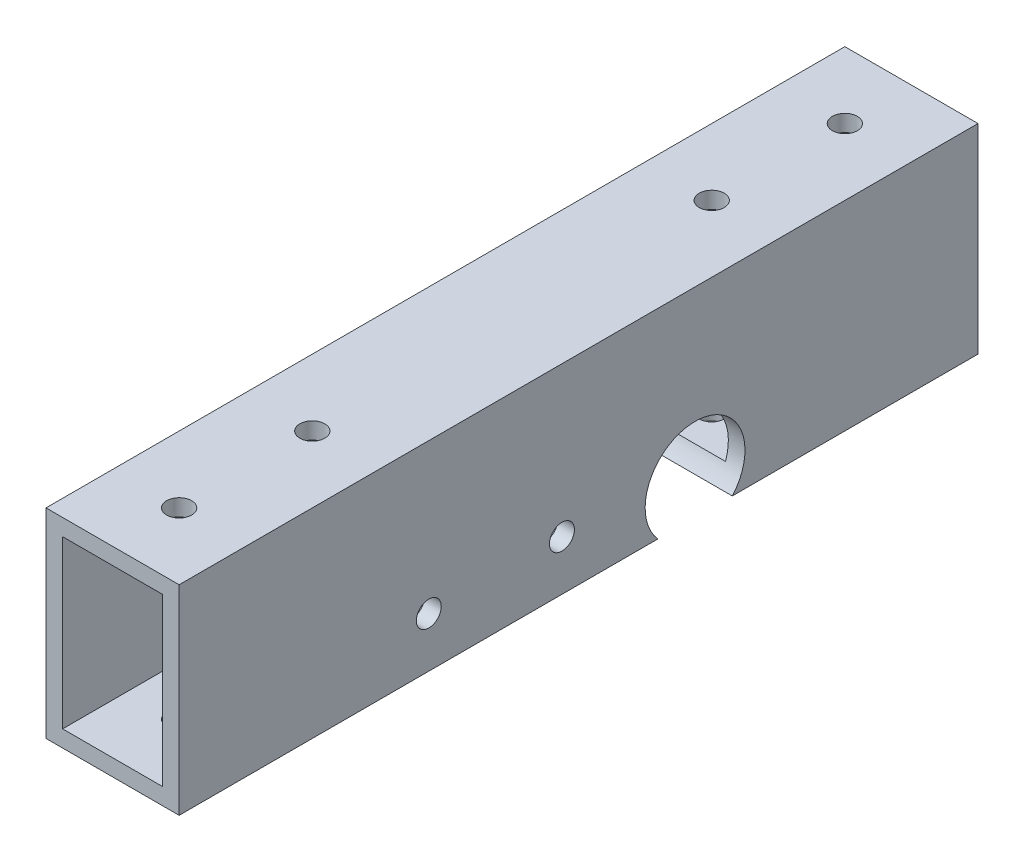
ISO-10303-21;
HEADER;
FILE_DESCRIPTION(('STEP AP214'),'2;1');
FILE_NAME('part.step','',(''),(''),'','','');
FILE_SCHEMA(('AUTOMOTIVE_DESIGN { 1 0 10303 214 1 1 1 1 }'));
ENDSEC;
DATA;
#1=APPLICATION_CONTEXT('core data for automotive mechanical design processes');
#2=APPLICATION_PROTOCOL_DEFINITION('international standard','automotive_design',2000,#1);
#3=PRODUCT_CONTEXT('',#1,'mechanical');
#4=PRODUCT('Part','Part','',(#3));
#5=PRODUCT_RELATED_PRODUCT_CATEGORY('part','',(#4));
#6=PRODUCT_DEFINITION_FORMATION('','',#4);
#7=PRODUCT_DEFINITION_CONTEXT('part definition',#1,'design');
#8=PRODUCT_DEFINITION('design','',#6,#7);
#9=PRODUCT_DEFINITION_SHAPE('','',#8);
#10=(LENGTH_UNIT() NAMED_UNIT(*) SI_UNIT(.MILLI.,.METRE.));
#11=(NAMED_UNIT(*) PLANE_ANGLE_UNIT() SI_UNIT($,.RADIAN.));
#12=(NAMED_UNIT(*) SI_UNIT($,.STERADIAN.) SOLID_ANGLE_UNIT());
#13=UNCERTAINTY_MEASURE_WITH_UNIT(LENGTH_MEASURE(1.E-05),#10,'distance_accuracy_value','');
#14=(GEOMETRIC_REPRESENTATION_CONTEXT(3) GLOBAL_UNCERTAINTY_ASSIGNED_CONTEXT((#13)) GLOBAL_UNIT_ASSIGNED_CONTEXT((#10,
#11,#12)) REPRESENTATION_CONTEXT('',''));
#15=CARTESIAN_POINT('',(0.,0.,0.));
#16=DIRECTION('',(0.,0.,1.));
#17=DIRECTION('',(1.,0.,0.));
#18=AXIS2_PLACEMENT_3D('',#15,#16,#17);
#19=CARTESIAN_POINT('',(-12.7,-19.05,152.4));
#20=DIRECTION('',(0.,1.,0.));
#21=DIRECTION('',(0.,0.,1.));
#22=AXIS2_PLACEMENT_3D('',#19,#20,#21);
#23=PLANE('',#22);
#24=CARTESIAN_POINT('',(0.,-19.05,139.7));
#25=DIRECTION('',(0.,1.,0.));
#26=DIRECTION('',(0.,0.,1.));
#27=AXIS2_PLACEMENT_3D('',#24,#25,#26);
#28=CIRCLE('',#27,2.38125);
#29=CARTESIAN_POINT('',(0.,-19.05,142.08125));
#30=VERTEX_POINT('',#29);
#31=EDGE_CURVE('E164',#30,#30,#28,.T.);
#32=ORIENTED_EDGE('',*,*,#31,.T.);
#33=EDGE_LOOP('',(#32));
#34=FACE_BOUND('',#33,.T.);
#35=CARTESIAN_POINT('',(0.,-19.05,114.3));
#36=DIRECTION('',(0.,1.,0.));
#37=DIRECTION('',(0.,0.,1.));
#38=AXIS2_PLACEMENT_3D('',#35,#36,#37);
#39=CIRCLE('',#38,2.38125);
#40=CARTESIAN_POINT('',(0.,-19.05,116.68125));
#41=VERTEX_POINT('',#40);
#42=EDGE_CURVE('E217',#41,#41,#39,.T.);
#43=ORIENTED_EDGE('',*,*,#42,.T.);
#44=EDGE_LOOP('',(#43));
#45=FACE_BOUND('',#44,.T.);
#46=DIRECTION('',(0.,0.,-1.));
#47=VECTOR('',#46,1.);
#48=CARTESIAN_POINT('',(-12.7,-19.05,152.4));
#49=LINE('',#48,#47);
#50=CARTESIAN_POINT('',(-12.7,-19.05,152.4));
#51=VERTEX_POINT('',#50);
#52=CARTESIAN_POINT('',(-12.7,-19.05,61.0745158285618));
#53=VERTEX_POINT('',#52);
#54=EDGE_CURVE('E141',#51,#53,#49,.T.);
#55=ORIENTED_EDGE('',*,*,#54,.T.);
#56=DIRECTION('',(1.,0.,0.));
#57=VECTOR('',#56,1.);
#58=CARTESIAN_POINT('',(-12.7,-19.05,61.0745158285618));
#59=LINE('',#58,#57);
#60=CARTESIAN_POINT('',(12.7,-19.05,61.0745158285618));
#61=VERTEX_POINT('',#60);
#62=EDGE_CURVE('E125',#53,#61,#59,.T.);
#63=ORIENTED_EDGE('',*,*,#62,.T.);
#64=DIRECTION('',(0.,0.,-1.));
#65=VECTOR('',#64,1.);
#66=CARTESIAN_POINT('',(12.7,-19.05,152.4));
#67=LINE('',#66,#65);
#68=CARTESIAN_POINT('',(12.7,-19.05,152.4));
#69=VERTEX_POINT('',#68);
#70=EDGE_CURVE('E153',#69,#61,#67,.T.);
#71=ORIENTED_EDGE('',*,*,#70,.F.);
#72=DIRECTION('',(1.,0.,0.));
#73=VECTOR('',#72,1.);
#74=CARTESIAN_POINT('',(-12.7,-19.05,152.4));
#75=LINE('',#74,#73);
#76=EDGE_CURVE('E147',#51,#69,#75,.T.);
#77=ORIENTED_EDGE('',*,*,#76,.F.);
#78=EDGE_LOOP('',(#55,#63,#71,#77));
#79=FACE_BOUND('',#78,.T.);
#80=ADVANCED_FACE('F37',(#34,#45,#79),#23,.F.);
#81=CARTESIAN_POINT('',(-12.7,-15.875,152.4));
#82=DIRECTION('',(0.,1.,0.));
#83=DIRECTION('',(0.,0.,1.));
#84=AXIS2_PLACEMENT_3D('',#81,#82,#83);
#85=PLANE('',#84);
#86=CARTESIAN_POINT('',(0.,-15.875,139.7));
#87=DIRECTION('',(0.,1.,0.));
#88=DIRECTION('',(0.,0.,1.));
#89=AXIS2_PLACEMENT_3D('',#86,#87,#88);
#90=CIRCLE('',#89,2.38125);
#91=CARTESIAN_POINT('',(0.,-15.875,142.08125));
#92=VERTEX_POINT('',#91);
#93=EDGE_CURVE('E168',#92,#92,#90,.T.);
#94=ORIENTED_EDGE('',*,*,#93,.F.);
#95=EDGE_LOOP('',(#94));
#96=FACE_BOUND('',#95,.T.);
#97=CARTESIAN_POINT('',(0.,-15.875,114.3));
#98=DIRECTION('',(0.,1.,0.));
#99=DIRECTION('',(0.,0.,1.));
#100=AXIS2_PLACEMENT_3D('',#97,#98,#99);
#101=CIRCLE('',#100,2.38125);
#102=CARTESIAN_POINT('',(0.,-15.875,116.68125));
#103=VERTEX_POINT('',#102);
#104=EDGE_CURVE('E163',#103,#103,#101,.T.);
#105=ORIENTED_EDGE('',*,*,#104,.F.);
#106=EDGE_LOOP('',(#105));
#107=FACE_BOUND('',#106,.T.);
#108=DIRECTION('',(1.,0.,0.));
#109=VECTOR('',#108,1.);
#110=CARTESIAN_POINT('',(-12.7,-15.875,62.9552561210692));
#111=LINE('',#110,#109);
#112=CARTESIAN_POINT('',(-9.525,-15.875,62.9552561210692));
#113=VERTEX_POINT('',#112);
#114=CARTESIAN_POINT('',(9.525,-15.875,62.9552561210692));
#115=VERTEX_POINT('',#114);
#116=EDGE_CURVE('E11',#113,#115,#111,.T.);
#117=ORIENTED_EDGE('',*,*,#116,.F.);
#118=DIRECTION('',(0.,0.,-1.));
#119=VECTOR('',#118,1.);
#120=CARTESIAN_POINT('',(-9.525,-15.875,152.4));
#121=LINE('',#120,#119);
#122=CARTESIAN_POINT('',(-9.525,-15.875,152.4));
#123=VERTEX_POINT('',#122);
#124=EDGE_CURVE('E248',#123,#113,#121,.T.);
#125=ORIENTED_EDGE('',*,*,#124,.F.);
#126=DIRECTION('',(1.,0.,0.));
#127=VECTOR('',#126,1.);
#128=CARTESIAN_POINT('',(-12.7,-15.875,152.4));
#129=LINE('',#128,#127);
#130=CARTESIAN_POINT('',(9.525,-15.875,152.4));
#131=VERTEX_POINT('',#130);
#132=EDGE_CURVE('E269',#123,#131,#129,.T.);
#133=ORIENTED_EDGE('',*,*,#132,.T.);
#134=DIRECTION('',(0.,0.,-1.));
#135=VECTOR('',#134,1.);
#136=CARTESIAN_POINT('',(9.525,-15.875,152.4));
#137=LINE('',#136,#135);
#138=EDGE_CURVE('E241',#131,#115,#137,.T.);
#139=ORIENTED_EDGE('',*,*,#138,.T.);
#140=EDGE_LOOP('',(#117,#125,#133,#139));
#141=FACE_BOUND('',#140,.T.);
#142=ADVANCED_FACE('F313',(#96,#107,#141),#85,.T.);
#143=CARTESIAN_POINT('',(12.7,19.05,152.4));
#144=DIRECTION('',(-1.,0.,0.));
#145=DIRECTION('',(0.,-1.,0.));
#146=AXIS2_PLACEMENT_3D('',#143,#144,#145);
#147=PLANE('',#146);
#148=CARTESIAN_POINT('',(12.7,-9.525,79.375));
#149=DIRECTION('',(1.,0.,0.));
#150=DIRECTION('',(0.,1.,0.));
#151=AXIS2_PLACEMENT_3D('',#148,#149,#150);
#152=CIRCLE('',#151,2.38125000000001);
#153=CARTESIAN_POINT('',(12.7,-7.14374999999999,79.375));
#154=VERTEX_POINT('',#153);
#155=EDGE_CURVE('E205',#154,#154,#152,.T.);
#156=ORIENTED_EDGE('',*,*,#155,.F.);
#157=EDGE_LOOP('',(#156));
#158=FACE_BOUND('',#157,.T.);
#159=CARTESIAN_POINT('',(12.7,-9.525,104.775));
#160=DIRECTION('',(1.,0.,0.));
#161=DIRECTION('',(0.,1.,0.));
#162=AXIS2_PLACEMENT_3D('',#159,#160,#161);
#163=CIRCLE('',#162,2.38125000000001);
#164=CARTESIAN_POINT('',(12.7,-7.14374999999999,104.775));
#165=VERTEX_POINT('',#164);
#166=EDGE_CURVE('E208',#165,#165,#163,.T.);
#167=ORIENTED_EDGE('',*,*,#166,.F.);
#168=EDGE_LOOP('',(#167));
#169=FACE_BOUND('',#168,.T.);
#170=ORIENTED_EDGE('',*,*,#70,.T.);
#171=CARTESIAN_POINT('',(12.7,-12.7,53.975));
#172=DIRECTION('',(1.,0.,0.));
#173=DIRECTION('',(0.,1.,0.));
#174=AXIS2_PLACEMENT_3D('',#171,#172,#173);
#175=CIRCLE('',#174,9.525);
#176=CARTESIAN_POINT('',(12.7,-19.05,46.8754841714382));
#177=VERTEX_POINT('',#176);
#178=EDGE_CURVE('E128',#177,#61,#175,.T.);
#179=ORIENTED_EDGE('',*,*,#178,.F.);
#180=CARTESIAN_POINT('',(12.7,-19.05,0.));
#181=VERTEX_POINT('',#180);
#182=EDGE_CURVE('E280',#177,#181,#67,.T.);
#183=ORIENTED_EDGE('',*,*,#182,.T.);
#184=DIRECTION('',(0.,1.,0.));
#185=VECTOR('',#184,1.);
#186=CARTESIAN_POINT('',(12.7,19.05,0.));
#187=LINE('',#186,#185);
#188=CARTESIAN_POINT('',(12.7,19.05,0.));
#189=VERTEX_POINT('',#188);
#190=EDGE_CURVE('E239',#181,#189,#187,.T.);
#191=ORIENTED_EDGE('',*,*,#190,.T.);
#192=DIRECTION('',(0.,0.,-1.));
#193=VECTOR('',#192,1.);
#194=CARTESIAN_POINT('',(12.7,19.05,152.4));
#195=LINE('',#194,#193);
#196=CARTESIAN_POINT('',(12.7,19.05,152.4));
#197=VERTEX_POINT('',#196);
#198=EDGE_CURVE('E151',#197,#189,#195,.T.);
#199=ORIENTED_EDGE('',*,*,#198,.F.);
#200=DIRECTION('',(0.,1.,0.));
#201=VECTOR('',#200,1.);
#202=CARTESIAN_POINT('',(12.7,19.05,152.4));
#203=LINE('',#202,#201);
#204=EDGE_CURVE('E271',#69,#197,#203,.T.);
#205=ORIENTED_EDGE('',*,*,#204,.F.);
#206=EDGE_LOOP('',(#170,#179,#183,#191,#199,#205));
#207=FACE_BOUND('',#206,.T.);
#208=ADVANCED_FACE('F39',(#158,#169,#207),#147,.F.);
#209=CARTESIAN_POINT('',(-12.7,19.05,152.4));
#210=DIRECTION('',(0.,-1.,0.));
#211=DIRECTION('',(0.,0.,-1.));
#212=AXIS2_PLACEMENT_3D('',#209,#210,#211);
#213=PLANE('',#212);
#214=CARTESIAN_POINT('',(0.,19.05,12.7));
#215=DIRECTION('',(0.,1.,0.));
#216=DIRECTION('',(0.,0.,1.));
#217=AXIS2_PLACEMENT_3D('',#214,#215,#216);
#218=CIRCLE('',#217,2.38125);
#219=CARTESIAN_POINT('',(0.,19.05,15.08125));
#220=VERTEX_POINT('',#219);
#221=EDGE_CURVE('E186',#220,#220,#218,.T.);
#222=ORIENTED_EDGE('',*,*,#221,.F.);
#223=EDGE_LOOP('',(#222));
#224=FACE_BOUND('',#223,.T.);
#225=CARTESIAN_POINT('',(0.,19.05,38.1));
#226=DIRECTION('',(0.,1.,0.));
#227=DIRECTION('',(0.,0.,1.));
#228=AXIS2_PLACEMENT_3D('',#225,#226,#227);
#229=CIRCLE('',#228,2.38125);
#230=CARTESIAN_POINT('',(0.,19.05,40.48125));
#231=VERTEX_POINT('',#230);
#232=EDGE_CURVE('E191',#231,#231,#229,.T.);
#233=ORIENTED_EDGE('',*,*,#232,.F.);
#234=EDGE_LOOP('',(#233));
#235=FACE_BOUND('',#234,.T.);
#236=CARTESIAN_POINT('',(0.,19.05,139.7));
#237=DIRECTION('',(0.,1.,0.));
#238=DIRECTION('',(0.,0.,1.));
#239=AXIS2_PLACEMENT_3D('',#236,#237,#238);
#240=CIRCLE('',#239,2.38125);
#241=CARTESIAN_POINT('',(0.,19.05,142.08125));
#242=VERTEX_POINT('',#241);
#243=EDGE_CURVE('E220',#242,#242,#240,.T.);
#244=ORIENTED_EDGE('',*,*,#243,.F.);
#245=EDGE_LOOP('',(#244));
#246=FACE_BOUND('',#245,.T.);
#247=CARTESIAN_POINT('',(0.,19.05,114.3));
#248=DIRECTION('',(0.,1.,0.));
#249=DIRECTION('',(0.,0.,1.));
#250=AXIS2_PLACEMENT_3D('',#247,#248,#249);
#251=CIRCLE('',#250,2.38125);
#252=CARTESIAN_POINT('',(0.,19.05,116.68125));
#253=VERTEX_POINT('',#252);
#254=EDGE_CURVE('E223',#253,#253,#251,.T.);
#255=ORIENTED_EDGE('',*,*,#254,.F.);
#256=EDGE_LOOP('',(#255));
#257=FACE_BOUND('',#256,.T.);
#258=DIRECTION('',(-1.,0.,0.));
#259=VECTOR('',#258,1.);
#260=CARTESIAN_POINT('',(-12.7,19.05,0.));
#261=LINE('',#260,#259);
#262=CARTESIAN_POINT('',(-12.7,19.05,0.));
#263=VERTEX_POINT('',#262);
#264=EDGE_CURVE('E283',#189,#263,#261,.T.);
#265=ORIENTED_EDGE('',*,*,#264,.T.);
#266=DIRECTION('',(0.,0.,-1.));
#267=VECTOR('',#266,1.);
#268=CARTESIAN_POINT('',(-12.7,19.05,152.4));
#269=LINE('',#268,#267);
#270=CARTESIAN_POINT('',(-12.7,19.05,152.4));
#271=VERTEX_POINT('',#270);
#272=EDGE_CURVE('E148',#271,#263,#269,.T.);
#273=ORIENTED_EDGE('',*,*,#272,.F.);
#274=DIRECTION('',(-1.,0.,0.));
#275=VECTOR('',#274,1.);
#276=CARTESIAN_POINT('',(-12.7,19.05,152.4));
#277=LINE('',#276,#275);
#278=EDGE_CURVE('E274',#197,#271,#277,.T.);
#279=ORIENTED_EDGE('',*,*,#278,.F.);
#280=ORIENTED_EDGE('',*,*,#198,.T.);
#281=EDGE_LOOP('',(#265,#273,#279,#280));
#282=FACE_BOUND('',#281,.T.);
#283=ADVANCED_FACE('F302',(#224,#235,#246,#257,#282),#213,.F.);
#284=CARTESIAN_POINT('',(-12.7,19.05,152.4));
#285=DIRECTION('',(1.,0.,0.));
#286=DIRECTION('',(0.,1.,0.));
#287=AXIS2_PLACEMENT_3D('',#284,#285,#286);
#288=PLANE('',#287);
#289=CARTESIAN_POINT('',(-12.7,-9.525,79.375));
#290=DIRECTION('',(1.,0.,0.));
#291=DIRECTION('',(0.,1.,0.));
#292=AXIS2_PLACEMENT_3D('',#289,#290,#291);
#293=CIRCLE('',#292,2.38125000000001);
#294=CARTESIAN_POINT('',(-12.7,-7.14375,79.375));
#295=VERTEX_POINT('',#294);
#296=EDGE_CURVE('E173',#295,#295,#293,.T.);
#297=ORIENTED_EDGE('',*,*,#296,.T.);
#298=EDGE_LOOP('',(#297));
#299=FACE_BOUND('',#298,.T.);
#300=CARTESIAN_POINT('',(-12.7,-9.525,104.775));
#301=DIRECTION('',(1.,0.,0.));
#302=DIRECTION('',(0.,1.,0.));
#303=AXIS2_PLACEMENT_3D('',#300,#301,#302);
#304=CIRCLE('',#303,2.38125000000001);
#305=CARTESIAN_POINT('',(-12.7,-7.14375,104.775));
#306=VERTEX_POINT('',#305);
#307=EDGE_CURVE('E202',#306,#306,#304,.T.);
#308=ORIENTED_EDGE('',*,*,#307,.T.);
#309=EDGE_LOOP('',(#308));
#310=FACE_BOUND('',#309,.T.);
#311=CARTESIAN_POINT('',(-12.7,-19.05,46.8754841714382));
#312=VERTEX_POINT('',#311);
#313=CARTESIAN_POINT('',(-12.7,-19.05,0.));
#314=VERTEX_POINT('',#313);
#315=EDGE_CURVE('E144',#312,#314,#49,.T.);
#316=ORIENTED_EDGE('',*,*,#315,.F.);
#317=CARTESIAN_POINT('',(-12.7,-12.7,53.975));
#318=DIRECTION('',(1.,0.,0.));
#319=DIRECTION('',(0.,1.,0.));
#320=AXIS2_PLACEMENT_3D('',#317,#318,#319);
#321=CIRCLE('',#320,9.525);
#322=EDGE_CURVE('E54',#312,#53,#321,.T.);
#323=ORIENTED_EDGE('',*,*,#322,.T.);
#324=ORIENTED_EDGE('',*,*,#54,.F.);
#325=DIRECTION('',(0.,-1.,0.));
#326=VECTOR('',#325,1.);
#327=CARTESIAN_POINT('',(-12.7,19.05,152.4));
#328=LINE('',#327,#326);
#329=EDGE_CURVE('E277',#271,#51,#328,.T.);
#330=ORIENTED_EDGE('',*,*,#329,.F.);
#331=ORIENTED_EDGE('',*,*,#272,.T.);
#332=DIRECTION('',(0.,-1.,0.));
#333=VECTOR('',#332,1.);
#334=CARTESIAN_POINT('',(-12.7,19.05,0.));
#335=LINE('',#334,#333);
#336=EDGE_CURVE('E285',#263,#314,#335,.T.);
#337=ORIENTED_EDGE('',*,*,#336,.T.);
#338=EDGE_LOOP('',(#316,#323,#324,#330,#331,#337));
#339=FACE_BOUND('',#338,.T.);
#340=ADVANCED_FACE('F139',(#299,#310,#339),#288,.F.);
#341=CARTESIAN_POINT('',(0.,-19.05,12.7));
#342=DIRECTION('',(0.,1.,0.));
#343=DIRECTION('',(0.,0.,1.));
#344=AXIS2_PLACEMENT_3D('',#341,#342,#343);
#345=CIRCLE('',#344,2.38125);
#346=CARTESIAN_POINT('',(0.,-19.05,15.08125));
#347=VERTEX_POINT('',#346);
#348=EDGE_CURVE('E180',#347,#347,#345,.T.);
#349=ORIENTED_EDGE('',*,*,#348,.T.);
#350=EDGE_LOOP('',(#349));
#351=FACE_BOUND('',#350,.T.);
#352=CARTESIAN_POINT('',(0.,-19.05,38.1));
#353=DIRECTION('',(0.,1.,0.));
#354=DIRECTION('',(0.,0.,1.));
#355=AXIS2_PLACEMENT_3D('',#352,#353,#354);
#356=CIRCLE('',#355,2.38125);
#357=CARTESIAN_POINT('',(0.,-19.05,40.48125));
#358=VERTEX_POINT('',#357);
#359=EDGE_CURVE('E196',#358,#358,#356,.T.);
#360=ORIENTED_EDGE('',*,*,#359,.T.);
#361=EDGE_LOOP('',(#360));
#362=FACE_BOUND('',#361,.T.);
#363=ORIENTED_EDGE('',*,*,#182,.F.);
#364=DIRECTION('',(1.,0.,0.));
#365=VECTOR('',#364,1.);
#366=CARTESIAN_POINT('',(-12.7,-19.05,46.8754841714382));
#367=LINE('',#366,#365);
#368=EDGE_CURVE('E134',#177,#312,#367,.F.);
#369=ORIENTED_EDGE('',*,*,#368,.T.);
#370=ORIENTED_EDGE('',*,*,#315,.T.);
#371=DIRECTION('',(1.,0.,0.));
#372=VECTOR('',#371,1.);
#373=CARTESIAN_POINT('',(-12.7,-19.05,0.));
#374=LINE('',#373,#372);
#375=EDGE_CURVE('E275',#314,#181,#374,.T.);
#376=ORIENTED_EDGE('',*,*,#375,.T.);
#377=EDGE_LOOP('',(#363,#369,#370,#376));
#378=FACE_BOUND('',#377,.T.);
#379=ADVANCED_FACE('F291',(#351,#362,#378),#23,.F.);
#380=CARTESIAN_POINT('',(0.,0.,152.4));
#381=DIRECTION('',(0.,0.,1.));
#382=DIRECTION('',(1.,0.,0.));
#383=AXIS2_PLACEMENT_3D('',#380,#381,#382);
#384=PLANE('',#383);
#385=DIRECTION('',(0.,1.,0.));
#386=VECTOR('',#385,1.);
#387=CARTESIAN_POINT('',(9.525,19.05,152.4));
#388=LINE('',#387,#386);
#389=CARTESIAN_POINT('',(9.525,15.875,152.4));
#390=VERTEX_POINT('',#389);
#391=EDGE_CURVE('E257',#131,#390,#388,.T.);
#392=ORIENTED_EDGE('',*,*,#391,.F.);
#393=ORIENTED_EDGE('',*,*,#132,.F.);
#394=DIRECTION('',(0.,-1.,0.));
#395=VECTOR('',#394,1.);
#396=CARTESIAN_POINT('',(-9.525,19.05,152.4));
#397=LINE('',#396,#395);
#398=CARTESIAN_POINT('',(-9.525,15.875,152.4));
#399=VERTEX_POINT('',#398);
#400=EDGE_CURVE('E266',#399,#123,#397,.T.);
#401=ORIENTED_EDGE('',*,*,#400,.F.);
#402=DIRECTION('',(-1.,0.,0.));
#403=VECTOR('',#402,1.);
#404=CARTESIAN_POINT('',(-12.7,15.875,152.4));
#405=LINE('',#404,#403);
#406=EDGE_CURVE('E264',#390,#399,#405,.T.);
#407=ORIENTED_EDGE('',*,*,#406,.F.);
#408=EDGE_LOOP('',(#392,#393,#401,#407));
#409=FACE_BOUND('',#408,.T.);
#410=ORIENTED_EDGE('',*,*,#204,.T.);
#411=ORIENTED_EDGE('',*,*,#278,.T.);
#412=ORIENTED_EDGE('',*,*,#329,.T.);
#413=ORIENTED_EDGE('',*,*,#76,.T.);
#414=EDGE_LOOP('',(#410,#411,#412,#413));
#415=FACE_BOUND('',#414,.T.);
#416=ADVANCED_FACE('F299',(#409,#415),#384,.T.);
#417=CARTESIAN_POINT('',(0.,0.,0.));
#418=DIRECTION('',(0.,0.,1.));
#419=DIRECTION('',(1.,0.,0.));
#420=AXIS2_PLACEMENT_3D('',#417,#418,#419);
#421=PLANE('',#420);
#422=DIRECTION('',(1.,0.,0.));
#423=VECTOR('',#422,1.);
#424=CARTESIAN_POINT('',(-12.7,-15.875,0.));
#425=LINE('',#424,#423);
#426=CARTESIAN_POINT('',(-9.525,-15.875,0.));
#427=VERTEX_POINT('',#426);
#428=CARTESIAN_POINT('',(9.525,-15.875,0.));
#429=VERTEX_POINT('',#428);
#430=EDGE_CURVE('E254',#427,#429,#425,.T.);
#431=ORIENTED_EDGE('',*,*,#430,.T.);
#432=DIRECTION('',(0.,1.,0.));
#433=VECTOR('',#432,1.);
#434=CARTESIAN_POINT('',(9.525,19.05,0.));
#435=LINE('',#434,#433);
#436=CARTESIAN_POINT('',(9.525,15.875,0.));
#437=VERTEX_POINT('',#436);
#438=EDGE_CURVE('E133',#429,#437,#435,.T.);
#439=ORIENTED_EDGE('',*,*,#438,.T.);
#440=DIRECTION('',(-1.,0.,0.));
#441=VECTOR('',#440,1.);
#442=CARTESIAN_POINT('',(-12.7,15.875,0.));
#443=LINE('',#442,#441);
#444=CARTESIAN_POINT('',(-9.525,15.875,0.));
#445=VERTEX_POINT('',#444);
#446=EDGE_CURVE('E253',#437,#445,#443,.T.);
#447=ORIENTED_EDGE('',*,*,#446,.T.);
#448=DIRECTION('',(0.,-1.,0.));
#449=VECTOR('',#448,1.);
#450=CARTESIAN_POINT('',(-9.525,19.05,0.));
#451=LINE('',#450,#449);
#452=EDGE_CURVE('E258',#445,#427,#451,.T.);
#453=ORIENTED_EDGE('',*,*,#452,.T.);
#454=EDGE_LOOP('',(#431,#439,#447,#453));
#455=FACE_BOUND('',#454,.T.);
#456=ORIENTED_EDGE('',*,*,#190,.F.);
#457=ORIENTED_EDGE('',*,*,#375,.F.);
#458=ORIENTED_EDGE('',*,*,#336,.F.);
#459=ORIENTED_EDGE('',*,*,#264,.F.);
#460=EDGE_LOOP('',(#456,#457,#458,#459));
#461=FACE_BOUND('',#460,.T.);
#462=ADVANCED_FACE('F294',(#455,#461),#421,.F.);
#463=CARTESIAN_POINT('',(9.525,19.05,152.4));
#464=DIRECTION('',(-1.,0.,0.));
#465=DIRECTION('',(0.,-1.,0.));
#466=AXIS2_PLACEMENT_3D('',#463,#464,#465);
#467=PLANE('',#466);
#468=CARTESIAN_POINT('',(9.525,-9.525,79.375));
#469=DIRECTION('',(-1.,0.,0.));
#470=DIRECTION('',(0.,-1.,0.));
#471=AXIS2_PLACEMENT_3D('',#468,#469,#470);
#472=CIRCLE('',#471,2.38125000000001);
#473=CARTESIAN_POINT('',(9.525,-11.90625,79.375));
#474=VERTEX_POINT('',#473);
#475=EDGE_CURVE('E176',#474,#474,#472,.T.);
#476=ORIENTED_EDGE('',*,*,#475,.F.);
#477=EDGE_LOOP('',(#476));
#478=FACE_BOUND('',#477,.T.);
#479=CARTESIAN_POINT('',(9.525,-9.525,104.775));
#480=DIRECTION('',(-1.,0.,0.));
#481=DIRECTION('',(0.,-1.,0.));
#482=AXIS2_PLACEMENT_3D('',#479,#480,#481);
#483=CIRCLE('',#482,2.38125000000001);
#484=CARTESIAN_POINT('',(9.525,-11.90625,104.775));
#485=VERTEX_POINT('',#484);
#486=EDGE_CURVE('E172',#485,#485,#483,.T.);
#487=ORIENTED_EDGE('',*,*,#486,.F.);
#488=EDGE_LOOP('',(#487));
#489=FACE_BOUND('',#488,.T.);
#490=CARTESIAN_POINT('',(9.525,-12.7,53.975));
#491=DIRECTION('',(-1.,0.,0.));
#492=DIRECTION('',(0.,-1.,0.));
#493=AXIS2_PLACEMENT_3D('',#490,#491,#492);
#494=CIRCLE('',#493,9.525);
#495=CARTESIAN_POINT('',(9.525,-15.875,44.9947438789308));
#496=VERTEX_POINT('',#495);
#497=EDGE_CURVE('E61',#115,#496,#494,.T.);
#498=ORIENTED_EDGE('',*,*,#497,.F.);
#499=ORIENTED_EDGE('',*,*,#138,.F.);
#500=ORIENTED_EDGE('',*,*,#391,.T.);
#501=DIRECTION('',(0.,0.,-1.));
#502=VECTOR('',#501,1.);
#503=CARTESIAN_POINT('',(9.525,15.875,152.4));
#504=LINE('',#503,#502);
#505=EDGE_CURVE('E236',#390,#437,#504,.T.);
#506=ORIENTED_EDGE('',*,*,#505,.T.);
#507=ORIENTED_EDGE('',*,*,#438,.F.);
#508=EDGE_CURVE('E245',#496,#429,#137,.T.);
#509=ORIENTED_EDGE('',*,*,#508,.F.);
#510=EDGE_LOOP('',(#498,#499,#500,#506,#507,#509));
#511=FACE_BOUND('',#510,.T.);
#512=ADVANCED_FACE('F406',(#478,#489,#511),#467,.T.);
#513=CARTESIAN_POINT('',(-12.7,15.875,152.4));
#514=DIRECTION('',(0.,-1.,0.));
#515=DIRECTION('',(0.,0.,-1.));
#516=AXIS2_PLACEMENT_3D('',#513,#514,#515);
#517=PLANE('',#516);
#518=CARTESIAN_POINT('',(0.,15.875,12.7));
#519=DIRECTION('',(0.,-1.,0.));
#520=DIRECTION('',(0.,0.,-1.));
#521=AXIS2_PLACEMENT_3D('',#518,#519,#520);
#522=CIRCLE('',#521,2.38125);
#523=CARTESIAN_POINT('',(0.,15.875,10.31875));
#524=VERTEX_POINT('',#523);
#525=EDGE_CURVE('E199',#524,#524,#522,.T.);
#526=ORIENTED_EDGE('',*,*,#525,.F.);
#527=EDGE_LOOP('',(#526));
#528=FACE_BOUND('',#527,.T.);
#529=CARTESIAN_POINT('',(0.,15.875,38.1));
#530=DIRECTION('',(0.,-1.,0.));
#531=DIRECTION('',(0.,0.,-1.));
#532=AXIS2_PLACEMENT_3D('',#529,#530,#531);
#533=CIRCLE('',#532,2.38125);
#534=CARTESIAN_POINT('',(0.,15.875,35.71875));
#535=VERTEX_POINT('',#534);
#536=EDGE_CURVE('E179',#535,#535,#533,.T.);
#537=ORIENTED_EDGE('',*,*,#536,.F.);
#538=EDGE_LOOP('',(#537));
#539=FACE_BOUND('',#538,.T.);
#540=CARTESIAN_POINT('',(0.,15.875,139.7));
#541=DIRECTION('',(0.,-1.,0.));
#542=DIRECTION('',(0.,0.,-1.));
#543=AXIS2_PLACEMENT_3D('',#540,#541,#542);
#544=CIRCLE('',#543,2.38125);
#545=CARTESIAN_POINT('',(0.,15.875,137.31875));
#546=VERTEX_POINT('',#545);
#547=EDGE_CURVE('E165',#546,#546,#544,.T.);
#548=ORIENTED_EDGE('',*,*,#547,.F.);
#549=EDGE_LOOP('',(#548));
#550=FACE_BOUND('',#549,.T.);
#551=CARTESIAN_POINT('',(0.,15.875,114.3));
#552=DIRECTION('',(0.,-1.,0.));
#553=DIRECTION('',(0.,0.,-1.));
#554=AXIS2_PLACEMENT_3D('',#551,#552,#553);
#555=CIRCLE('',#554,2.38125);
#556=CARTESIAN_POINT('',(0.,15.875,111.91875));
#557=VERTEX_POINT('',#556);
#558=EDGE_CURVE('E160',#557,#557,#555,.T.);
#559=ORIENTED_EDGE('',*,*,#558,.F.);
#560=EDGE_LOOP('',(#559));
#561=FACE_BOUND('',#560,.T.);
#562=ORIENTED_EDGE('',*,*,#446,.F.);
#563=ORIENTED_EDGE('',*,*,#505,.F.);
#564=ORIENTED_EDGE('',*,*,#406,.T.);
#565=DIRECTION('',(0.,0.,-1.));
#566=VECTOR('',#565,1.);
#567=CARTESIAN_POINT('',(-9.525,15.875,152.4));
#568=LINE('',#567,#566);
#569=EDGE_CURVE('E240',#399,#445,#568,.T.);
#570=ORIENTED_EDGE('',*,*,#569,.T.);
#571=EDGE_LOOP('',(#562,#563,#564,#570));
#572=FACE_BOUND('',#571,.T.);
#573=ADVANCED_FACE('F414',(#528,#539,#550,#561,#572),#517,.T.);
#574=CARTESIAN_POINT('',(-9.525,19.05,152.4));
#575=DIRECTION('',(1.,0.,0.));
#576=DIRECTION('',(0.,1.,0.));
#577=AXIS2_PLACEMENT_3D('',#574,#575,#576);
#578=PLANE('',#577);
#579=CARTESIAN_POINT('',(-9.525,-9.525,79.375));
#580=DIRECTION('',(1.,0.,0.));
#581=DIRECTION('',(0.,1.,0.));
#582=AXIS2_PLACEMENT_3D('',#579,#580,#581);
#583=CIRCLE('',#582,2.38125000000001);
#584=CARTESIAN_POINT('',(-9.525,-7.14375,79.375));
#585=VERTEX_POINT('',#584);
#586=EDGE_CURVE('E174',#585,#585,#583,.T.);
#587=ORIENTED_EDGE('',*,*,#586,.F.);
#588=EDGE_LOOP('',(#587));
#589=FACE_BOUND('',#588,.T.);
#590=CARTESIAN_POINT('',(-9.525,-9.525,104.775));
#591=DIRECTION('',(1.,0.,0.));
#592=DIRECTION('',(0.,1.,0.));
#593=AXIS2_PLACEMENT_3D('',#590,#591,#592);
#594=CIRCLE('',#593,2.38125000000001);
#595=CARTESIAN_POINT('',(-9.525,-7.14375,104.775));
#596=VERTEX_POINT('',#595);
#597=EDGE_CURVE('E169',#596,#596,#594,.T.);
#598=ORIENTED_EDGE('',*,*,#597,.F.);
#599=EDGE_LOOP('',(#598));
#600=FACE_BOUND('',#599,.T.);
#601=CARTESIAN_POINT('',(-9.525,-12.7,53.975));
#602=DIRECTION('',(1.,0.,0.));
#603=DIRECTION('',(0.,1.,0.));
#604=AXIS2_PLACEMENT_3D('',#601,#602,#603);
#605=CIRCLE('',#604,9.525);
#606=CARTESIAN_POINT('',(-9.525,-15.875,44.9947438789308));
#607=VERTEX_POINT('',#606);
#608=EDGE_CURVE('E145',#607,#113,#605,.T.);
#609=ORIENTED_EDGE('',*,*,#608,.F.);
#610=EDGE_CURVE('E244',#607,#427,#121,.T.);
#611=ORIENTED_EDGE('',*,*,#610,.T.);
#612=ORIENTED_EDGE('',*,*,#452,.F.);
#613=ORIENTED_EDGE('',*,*,#569,.F.);
#614=ORIENTED_EDGE('',*,*,#400,.T.);
#615=ORIENTED_EDGE('',*,*,#124,.T.);
#616=EDGE_LOOP('',(#609,#611,#612,#613,#614,#615));
#617=FACE_BOUND('',#616,.T.);
#618=ADVANCED_FACE('F398',(#589,#600,#617),#578,.T.);
#619=CARTESIAN_POINT('',(0.,-15.875,12.7));
#620=DIRECTION('',(0.,1.,0.));
#621=DIRECTION('',(0.,0.,1.));
#622=AXIS2_PLACEMENT_3D('',#619,#620,#621);
#623=CIRCLE('',#622,2.38125);
#624=CARTESIAN_POINT('',(0.,-15.875,15.08125));
#625=VERTEX_POINT('',#624);
#626=EDGE_CURVE('E41',#625,#625,#623,.T.);
#627=ORIENTED_EDGE('',*,*,#626,.F.);
#628=EDGE_LOOP('',(#627));
#629=FACE_BOUND('',#628,.T.);
#630=CARTESIAN_POINT('',(0.,-15.875,38.1));
#631=DIRECTION('',(0.,1.,0.));
#632=DIRECTION('',(0.,0.,1.));
#633=AXIS2_PLACEMENT_3D('',#630,#631,#632);
#634=CIRCLE('',#633,2.38125);
#635=CARTESIAN_POINT('',(0.,-15.875,40.48125));
#636=VERTEX_POINT('',#635);
#637=EDGE_CURVE('E177',#636,#636,#634,.T.);
#638=ORIENTED_EDGE('',*,*,#637,.F.);
#639=EDGE_LOOP('',(#638));
#640=FACE_BOUND('',#639,.T.);
#641=DIRECTION('',(1.,0.,0.));
#642=VECTOR('',#641,1.);
#643=CARTESIAN_POINT('',(-12.7,-15.875,44.9947438789308));
#644=LINE('',#643,#642);
#645=EDGE_CURVE('E46',#496,#607,#644,.F.);
#646=ORIENTED_EDGE('',*,*,#645,.F.);
#647=ORIENTED_EDGE('',*,*,#508,.T.);
#648=ORIENTED_EDGE('',*,*,#430,.F.);
#649=ORIENTED_EDGE('',*,*,#610,.F.);
#650=EDGE_LOOP('',(#646,#647,#648,#649));
#651=FACE_BOUND('',#650,.T.);
#652=ADVANCED_FACE('F325',(#629,#640,#651),#85,.T.);
#653=CARTESIAN_POINT('',(-12.7,-12.7,53.975));
#654=DIRECTION('',(1.,0.,0.));
#655=DIRECTION('',(0.,1.,0.));
#656=AXIS2_PLACEMENT_3D('',#653,#654,#655);
#657=CYLINDRICAL_SURFACE('',#656,9.525);
#658=ORIENTED_EDGE('',*,*,#116,.T.);
#659=ORIENTED_EDGE('',*,*,#497,.T.);
#660=ORIENTED_EDGE('',*,*,#645,.T.);
#661=ORIENTED_EDGE('',*,*,#608,.T.);
#662=EDGE_LOOP('',(#658,#659,#660,#661));
#663=FACE_BOUND('',#662,.T.);
#664=ORIENTED_EDGE('',*,*,#322,.F.);
#665=ORIENTED_EDGE('',*,*,#368,.F.);
#666=ORIENTED_EDGE('',*,*,#178,.T.);
#667=ORIENTED_EDGE('',*,*,#62,.F.);
#668=EDGE_LOOP('',(#664,#665,#666,#667));
#669=FACE_BOUND('',#668,.T.);
#670=ADVANCED_FACE('F126',(#663,#669),#657,.F.);
#671=CARTESIAN_POINT('',(0.,-19.05,114.3));
#672=DIRECTION('',(0.,1.,0.));
#673=DIRECTION('',(0.,0.,1.));
#674=AXIS2_PLACEMENT_3D('',#671,#672,#673);
#675=CYLINDRICAL_SURFACE('',#674,2.38125);
#676=ORIENTED_EDGE('',*,*,#558,.T.);
#677=EDGE_LOOP('',(#676));
#678=FACE_BOUND('',#677,.T.);
#679=ORIENTED_EDGE('',*,*,#254,.T.);
#680=EDGE_LOOP('',(#679));
#681=FACE_BOUND('',#680,.T.);
#682=ADVANCED_FACE('F368',(#678,#681),#675,.F.);
#683=CARTESIAN_POINT('',(0.,-19.05,139.7));
#684=DIRECTION('',(0.,1.,0.));
#685=DIRECTION('',(0.,0.,1.));
#686=AXIS2_PLACEMENT_3D('',#683,#684,#685);
#687=CYLINDRICAL_SURFACE('',#686,2.38125);
#688=ORIENTED_EDGE('',*,*,#547,.T.);
#689=EDGE_LOOP('',(#688));
#690=FACE_BOUND('',#689,.T.);
#691=ORIENTED_EDGE('',*,*,#243,.T.);
#692=EDGE_LOOP('',(#691));
#693=FACE_BOUND('',#692,.T.);
#694=ADVANCED_FACE('F370',(#690,#693),#687,.F.);
#695=ORIENTED_EDGE('',*,*,#104,.T.);
#696=EDGE_LOOP('',(#695));
#697=FACE_BOUND('',#696,.T.);
#698=ORIENTED_EDGE('',*,*,#42,.F.);
#699=EDGE_LOOP('',(#698));
#700=FACE_BOUND('',#699,.T.);
#701=ADVANCED_FACE('F373',(#697,#700),#675,.F.);
#702=ORIENTED_EDGE('',*,*,#93,.T.);
#703=EDGE_LOOP('',(#702));
#704=FACE_BOUND('',#703,.T.);
#705=ORIENTED_EDGE('',*,*,#31,.F.);
#706=EDGE_LOOP('',(#705));
#707=FACE_BOUND('',#706,.T.);
#708=ADVANCED_FACE('F380',(#704,#707),#687,.F.);
#709=CARTESIAN_POINT('',(-12.7,-9.525,104.775));
#710=DIRECTION('',(1.,0.,0.));
#711=DIRECTION('',(0.,1.,0.));
#712=AXIS2_PLACEMENT_3D('',#709,#710,#711);
#713=CYLINDRICAL_SURFACE('',#712,2.38125000000001);
#714=ORIENTED_EDGE('',*,*,#597,.T.);
#715=EDGE_LOOP('',(#714));
#716=FACE_BOUND('',#715,.T.);
#717=ORIENTED_EDGE('',*,*,#307,.F.);
#718=EDGE_LOOP('',(#717));
#719=FACE_BOUND('',#718,.T.);
#720=ADVANCED_FACE('F387',(#716,#719),#713,.F.);
#721=CARTESIAN_POINT('',(-12.7,-9.525,79.375));
#722=DIRECTION('',(1.,0.,0.));
#723=DIRECTION('',(0.,1.,0.));
#724=AXIS2_PLACEMENT_3D('',#721,#722,#723);
#725=CYLINDRICAL_SURFACE('',#724,2.38125000000001);
#726=ORIENTED_EDGE('',*,*,#586,.T.);
#727=EDGE_LOOP('',(#726));
#728=FACE_BOUND('',#727,.T.);
#729=ORIENTED_EDGE('',*,*,#296,.F.);
#730=EDGE_LOOP('',(#729));
#731=FACE_BOUND('',#730,.T.);
#732=ADVANCED_FACE('F353',(#728,#731),#725,.F.);
#733=ORIENTED_EDGE('',*,*,#486,.T.);
#734=EDGE_LOOP('',(#733));
#735=FACE_BOUND('',#734,.T.);
#736=ORIENTED_EDGE('',*,*,#166,.T.);
#737=EDGE_LOOP('',(#736));
#738=FACE_BOUND('',#737,.T.);
#739=ADVANCED_FACE('F350',(#735,#738),#713,.F.);
#740=ORIENTED_EDGE('',*,*,#475,.T.);
#741=EDGE_LOOP('',(#740));
#742=FACE_BOUND('',#741,.T.);
#743=ORIENTED_EDGE('',*,*,#155,.T.);
#744=EDGE_LOOP('',(#743));
#745=FACE_BOUND('',#744,.T.);
#746=ADVANCED_FACE('F340',(#742,#745),#725,.F.);
#747=CARTESIAN_POINT('',(0.,-19.05,38.1));
#748=DIRECTION('',(0.,1.,0.));
#749=DIRECTION('',(0.,0.,1.));
#750=AXIS2_PLACEMENT_3D('',#747,#748,#749);
#751=CYLINDRICAL_SURFACE('',#750,2.38125);
#752=ORIENTED_EDGE('',*,*,#637,.T.);
#753=EDGE_LOOP('',(#752));
#754=FACE_BOUND('',#753,.T.);
#755=ORIENTED_EDGE('',*,*,#359,.F.);
#756=EDGE_LOOP('',(#755));
#757=FACE_BOUND('',#756,.T.);
#758=ADVANCED_FACE('F337',(#754,#757),#751,.F.);
#759=CARTESIAN_POINT('',(0.,-19.05,12.7));
#760=DIRECTION('',(0.,1.,0.));
#761=DIRECTION('',(0.,0.,1.));
#762=AXIS2_PLACEMENT_3D('',#759,#760,#761);
#763=CYLINDRICAL_SURFACE('',#762,2.38125);
#764=ORIENTED_EDGE('',*,*,#626,.T.);
#765=EDGE_LOOP('',(#764));
#766=FACE_BOUND('',#765,.T.);
#767=ORIENTED_EDGE('',*,*,#348,.F.);
#768=EDGE_LOOP('',(#767));
#769=FACE_BOUND('',#768,.T.);
#770=ADVANCED_FACE('F339',(#766,#769),#763,.F.);
#771=ORIENTED_EDGE('',*,*,#536,.T.);
#772=EDGE_LOOP('',(#771));
#773=FACE_BOUND('',#772,.T.);
#774=ORIENTED_EDGE('',*,*,#232,.T.);
#775=EDGE_LOOP('',(#774));
#776=FACE_BOUND('',#775,.T.);
#777=ADVANCED_FACE('F342',(#773,#776),#751,.F.);
#778=ORIENTED_EDGE('',*,*,#525,.T.);
#779=EDGE_LOOP('',(#778));
#780=FACE_BOUND('',#779,.T.);
#781=ORIENTED_EDGE('',*,*,#221,.T.);
#782=EDGE_LOOP('',(#781));
#783=FACE_BOUND('',#782,.T.);
#784=ADVANCED_FACE('F349',(#780,#783),#763,.F.);
#785=CLOSED_SHELL('',(#80,#142,#208,#283,#340,#379,#416,#462,#512,#573,#618,#652,#670,#682,#694,
#701,#708,#720,#732,#739,#746,#758,#770,#777,#784));
#786=MANIFOLD_SOLID_BREP('B2',#785);
#787=ADVANCED_BREP_SHAPE_REPRESENTATION('',(#18,#786),#14);
#788=SHAPE_DEFINITION_REPRESENTATION(#9,#787);
ENDSEC;
END-ISO-10303-21;
